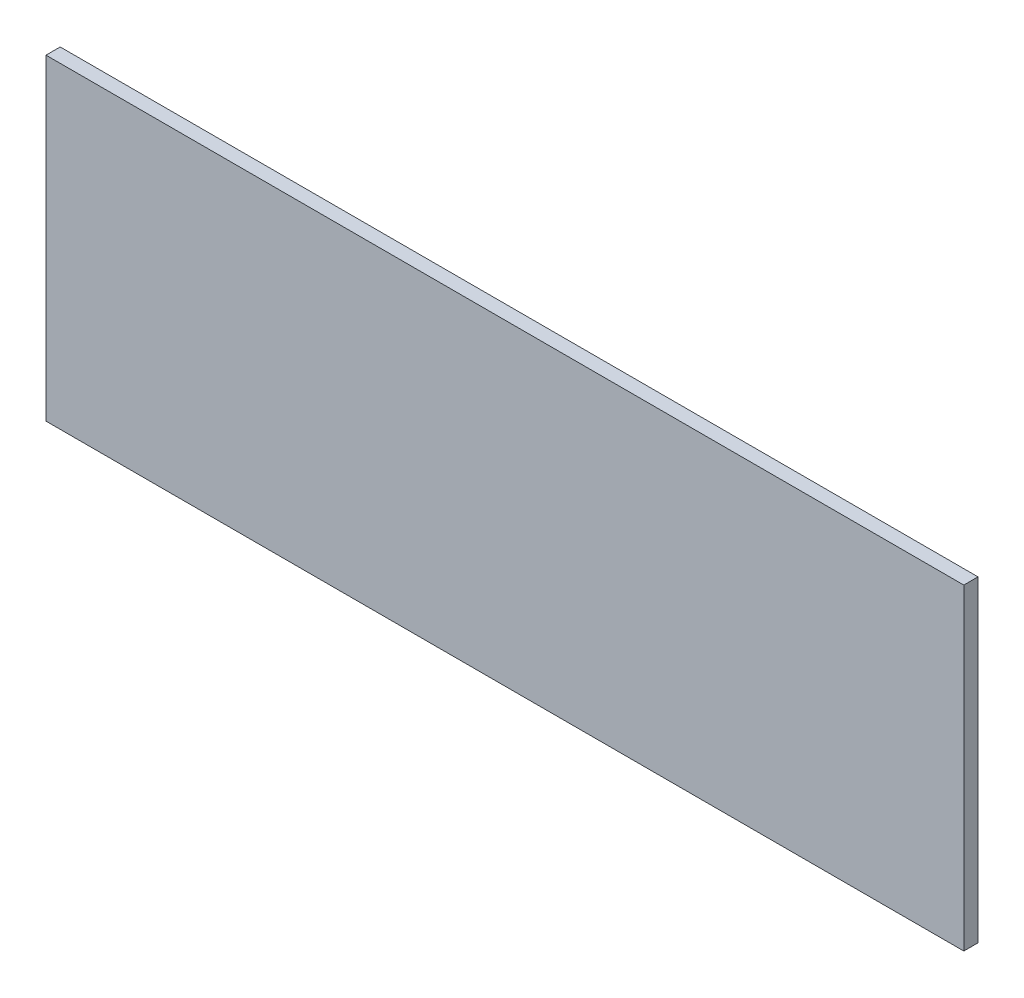
ISO-10303-21;
HEADER;
FILE_DESCRIPTION(('STEP AP214'),'2;1');
FILE_NAME('part.step','',(''),(''),'','','');
FILE_SCHEMA(('AUTOMOTIVE_DESIGN { 1 0 10303 214 1 1 1 1 }'));
ENDSEC;
DATA;
#1=APPLICATION_CONTEXT('core data for automotive mechanical design processes');
#2=APPLICATION_PROTOCOL_DEFINITION('international standard','automotive_design',2000,#1);
#3=PRODUCT_CONTEXT('',#1,'mechanical');
#4=PRODUCT('Part','Part','',(#3));
#5=PRODUCT_RELATED_PRODUCT_CATEGORY('part','',(#4));
#6=PRODUCT_DEFINITION_FORMATION('','',#4);
#7=PRODUCT_DEFINITION_CONTEXT('part definition',#1,'design');
#8=PRODUCT_DEFINITION('design','',#6,#7);
#9=PRODUCT_DEFINITION_SHAPE('','',#8);
#10=(LENGTH_UNIT() NAMED_UNIT(*) SI_UNIT(.MILLI.,.METRE.));
#11=(NAMED_UNIT(*) PLANE_ANGLE_UNIT() SI_UNIT($,.RADIAN.));
#12=(NAMED_UNIT(*) SI_UNIT($,.STERADIAN.) SOLID_ANGLE_UNIT());
#13=UNCERTAINTY_MEASURE_WITH_UNIT(LENGTH_MEASURE(1.E-05),#10,'distance_accuracy_value','');
#14=(GEOMETRIC_REPRESENTATION_CONTEXT(3) GLOBAL_UNCERTAINTY_ASSIGNED_CONTEXT((#13)) GLOBAL_UNIT_ASSIGNED_CONTEXT((#10,
#11,#12)) REPRESENTATION_CONTEXT('',''));
#15=CARTESIAN_POINT('',(0.,0.,0.));
#16=DIRECTION('',(0.,0.,1.));
#17=DIRECTION('',(1.,0.,0.));
#18=AXIS2_PLACEMENT_3D('',#15,#16,#17);
#19=CARTESIAN_POINT('',(0.,0.,3.));
#20=DIRECTION('',(1.,0.,0.));
#21=DIRECTION('',(0.,0.,-1.));
#22=AXIS2_PLACEMENT_3D('',#19,#20,#21);
#23=PLANE('',#22);
#24=DIRECTION('',(0.,-1.,0.));
#25=VECTOR('',#24,1.);
#26=CARTESIAN_POINT('',(0.,0.,0.));
#27=LINE('',#26,#25);
#28=CARTESIAN_POINT('',(0.,67.,0.));
#29=VERTEX_POINT('',#28);
#30=CARTESIAN_POINT('',(0.,0.,0.));
#31=VERTEX_POINT('',#30);
#32=EDGE_CURVE('E105',#29,#31,#27,.T.);
#33=ORIENTED_EDGE('',*,*,#32,.T.);
#34=DIRECTION('',(0.,0.,-1.));
#35=VECTOR('',#34,1.);
#36=CARTESIAN_POINT('',(0.,0.,3.));
#37=LINE('',#36,#35);
#38=CARTESIAN_POINT('',(0.,0.,3.));
#39=VERTEX_POINT('',#38);
#40=EDGE_CURVE('E11',#39,#31,#37,.T.);
#41=ORIENTED_EDGE('',*,*,#40,.F.);
#42=DIRECTION('',(0.,-1.,0.));
#43=VECTOR('',#42,1.);
#44=CARTESIAN_POINT('',(0.,0.,3.));
#45=LINE('',#44,#43);
#46=CARTESIAN_POINT('',(0.,67.,3.));
#47=VERTEX_POINT('',#46);
#48=EDGE_CURVE('E89',#47,#39,#45,.T.);
#49=ORIENTED_EDGE('',*,*,#48,.F.);
#50=DIRECTION('',(0.,0.,-1.));
#51=VECTOR('',#50,1.);
#52=CARTESIAN_POINT('',(0.,67.,3.));
#53=LINE('',#52,#51);
#54=EDGE_CURVE('E97',#47,#29,#53,.T.);
#55=ORIENTED_EDGE('',*,*,#54,.T.);
#56=EDGE_LOOP('',(#33,#41,#49,#55));
#57=FACE_BOUND('',#56,.T.);
#58=ADVANCED_FACE('F39',(#57),#23,.F.);
#59=CARTESIAN_POINT('',(0.,0.,3.));
#60=DIRECTION('',(0.,1.,0.));
#61=DIRECTION('',(0.,0.,1.));
#62=AXIS2_PLACEMENT_3D('',#59,#60,#61);
#63=PLANE('',#62);
#64=DIRECTION('',(1.,0.,0.));
#65=VECTOR('',#64,1.);
#66=CARTESIAN_POINT('',(0.,0.,0.));
#67=LINE('',#66,#65);
#68=CARTESIAN_POINT('',(194.,0.,0.));
#69=VERTEX_POINT('',#68);
#70=EDGE_CURVE('E92',#31,#69,#67,.T.);
#71=ORIENTED_EDGE('',*,*,#70,.T.);
#72=DIRECTION('',(0.,0.,-1.));
#73=VECTOR('',#72,1.);
#74=CARTESIAN_POINT('',(194.,0.,3.));
#75=LINE('',#74,#73);
#76=CARTESIAN_POINT('',(194.,0.,3.));
#77=VERTEX_POINT('',#76);
#78=EDGE_CURVE('E50',#77,#69,#75,.T.);
#79=ORIENTED_EDGE('',*,*,#78,.F.);
#80=DIRECTION('',(1.,0.,0.));
#81=VECTOR('',#80,1.);
#82=CARTESIAN_POINT('',(0.,0.,3.));
#83=LINE('',#82,#81);
#84=EDGE_CURVE('E82',#39,#77,#83,.T.);
#85=ORIENTED_EDGE('',*,*,#84,.F.);
#86=ORIENTED_EDGE('',*,*,#40,.T.);
#87=EDGE_LOOP('',(#71,#79,#85,#86));
#88=FACE_BOUND('',#87,.T.);
#89=ADVANCED_FACE('F93',(#88),#63,.F.);
#90=CARTESIAN_POINT('',(194.,0.,3.));
#91=DIRECTION('',(-1.,0.,0.));
#92=DIRECTION('',(0.,0.,1.));
#93=AXIS2_PLACEMENT_3D('',#90,#91,#92);
#94=PLANE('',#93);
#95=DIRECTION('',(0.,1.,0.));
#96=VECTOR('',#95,1.);
#97=CARTESIAN_POINT('',(194.,0.,0.));
#98=LINE('',#97,#96);
#99=CARTESIAN_POINT('',(194.,67.,0.));
#100=VERTEX_POINT('',#99);
#101=EDGE_CURVE('E72',#69,#100,#98,.T.);
#102=ORIENTED_EDGE('',*,*,#101,.T.);
#103=DIRECTION('',(0.,0.,-1.));
#104=VECTOR('',#103,1.);
#105=CARTESIAN_POINT('',(194.,67.,3.));
#106=LINE('',#105,#104);
#107=CARTESIAN_POINT('',(194.,67.,3.));
#108=VERTEX_POINT('',#107);
#109=EDGE_CURVE('E94',#108,#100,#106,.T.);
#110=ORIENTED_EDGE('',*,*,#109,.F.);
#111=DIRECTION('',(0.,1.,0.));
#112=VECTOR('',#111,1.);
#113=CARTESIAN_POINT('',(194.,0.,3.));
#114=LINE('',#113,#112);
#115=EDGE_CURVE('E88',#77,#108,#114,.T.);
#116=ORIENTED_EDGE('',*,*,#115,.F.);
#117=ORIENTED_EDGE('',*,*,#78,.T.);
#118=EDGE_LOOP('',(#102,#110,#116,#117));
#119=FACE_BOUND('',#118,.T.);
#120=ADVANCED_FACE('F96',(#119),#94,.F.);
#121=CARTESIAN_POINT('',(0.,67.,3.));
#122=DIRECTION('',(0.,-1.,0.));
#123=DIRECTION('',(0.,0.,-1.));
#124=AXIS2_PLACEMENT_3D('',#121,#122,#123);
#125=PLANE('',#124);
#126=DIRECTION('',(-1.,0.,0.));
#127=VECTOR('',#126,1.);
#128=CARTESIAN_POINT('',(0.,67.,0.));
#129=LINE('',#128,#127);
#130=EDGE_CURVE('E76',#100,#29,#129,.T.);
#131=ORIENTED_EDGE('',*,*,#130,.T.);
#132=ORIENTED_EDGE('',*,*,#54,.F.);
#133=DIRECTION('',(-1.,0.,0.));
#134=VECTOR('',#133,1.);
#135=CARTESIAN_POINT('',(0.,67.,3.));
#136=LINE('',#135,#134);
#137=EDGE_CURVE('E54',#108,#47,#136,.T.);
#138=ORIENTED_EDGE('',*,*,#137,.F.);
#139=ORIENTED_EDGE('',*,*,#109,.T.);
#140=EDGE_LOOP('',(#131,#132,#138,#139));
#141=FACE_BOUND('',#140,.T.);
#142=ADVANCED_FACE('F108',(#141),#125,.F.);
#143=CARTESIAN_POINT('',(0.,0.,3.));
#144=DIRECTION('',(0.,0.,-1.));
#145=DIRECTION('',(-1.,0.,0.));
#146=AXIS2_PLACEMENT_3D('',#143,#144,#145);
#147=PLANE('',#146);
#148=ORIENTED_EDGE('',*,*,#48,.T.);
#149=ORIENTED_EDGE('',*,*,#84,.T.);
#150=ORIENTED_EDGE('',*,*,#115,.T.);
#151=ORIENTED_EDGE('',*,*,#137,.T.);
#152=EDGE_LOOP('',(#148,#149,#150,#151));
#153=FACE_BOUND('',#152,.T.);
#154=ADVANCED_FACE('F86',(#153),#147,.F.);
#155=CARTESIAN_POINT('',(0.,0.,0.));
#156=DIRECTION('',(0.,0.,-1.));
#157=DIRECTION('',(-1.,0.,0.));
#158=AXIS2_PLACEMENT_3D('',#155,#156,#157);
#159=PLANE('',#158);
#160=ORIENTED_EDGE('',*,*,#32,.F.);
#161=ORIENTED_EDGE('',*,*,#130,.F.);
#162=ORIENTED_EDGE('',*,*,#101,.F.);
#163=ORIENTED_EDGE('',*,*,#70,.F.);
#164=EDGE_LOOP('',(#160,#161,#162,#163));
#165=FACE_BOUND('',#164,.T.);
#166=ADVANCED_FACE('F115',(#165),#159,.T.);
#167=CLOSED_SHELL('',(#58,#89,#120,#142,#154,#166));
#168=MANIFOLD_SOLID_BREP('B2',#167);
#169=ADVANCED_BREP_SHAPE_REPRESENTATION('',(#18,#168),#14);
#170=SHAPE_DEFINITION_REPRESENTATION(#9,#169);
ENDSEC;
END-ISO-10303-21;
